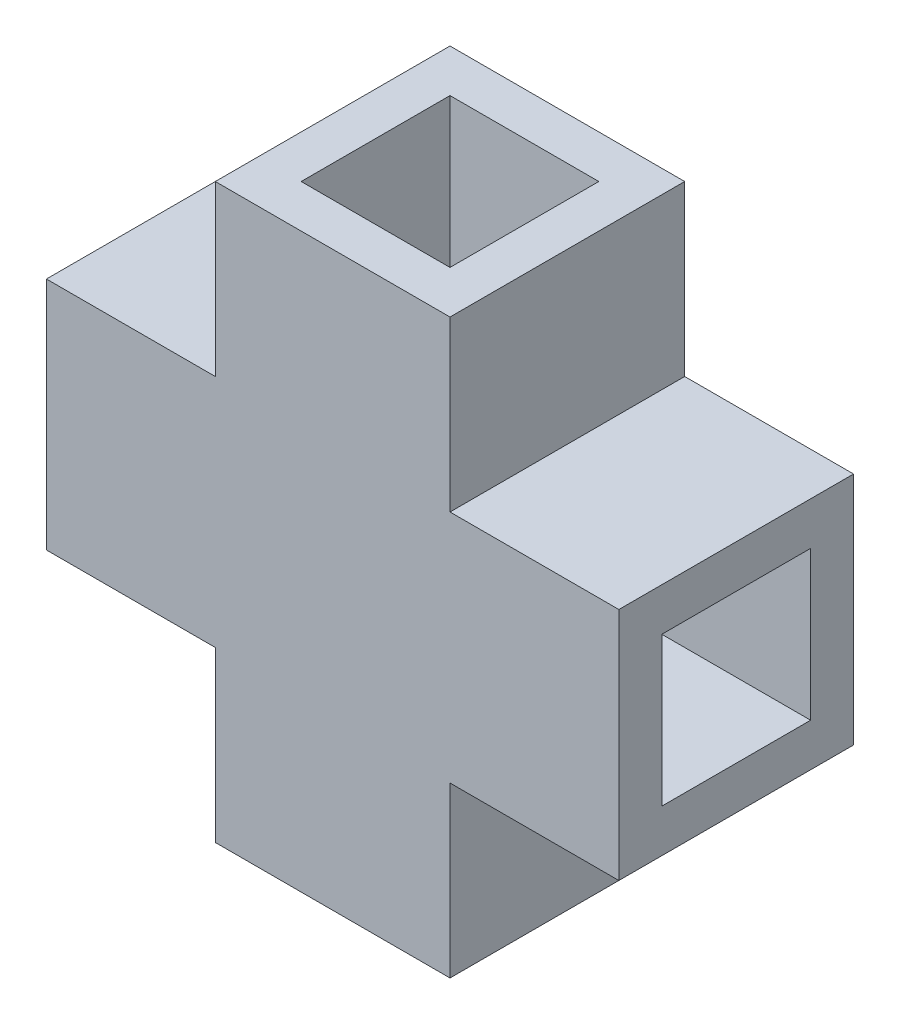
ISO-10303-21;
HEADER;
FILE_DESCRIPTION(('STEP AP214'),'2;1');
FILE_NAME('part.step','',(''),(''),'','','');
FILE_SCHEMA(('AUTOMOTIVE_DESIGN { 1 0 10303 214 1 1 1 1 }'));
ENDSEC;
DATA;
#1=APPLICATION_CONTEXT('core data for automotive mechanical design processes');
#2=APPLICATION_PROTOCOL_DEFINITION('international standard','automotive_design',2000,#1);
#3=PRODUCT_CONTEXT('',#1,'mechanical');
#4=PRODUCT('Part','Part','',(#3));
#5=PRODUCT_RELATED_PRODUCT_CATEGORY('part','',(#4));
#6=PRODUCT_DEFINITION_FORMATION('','',#4);
#7=PRODUCT_DEFINITION_CONTEXT('part definition',#1,'design');
#8=PRODUCT_DEFINITION('design','',#6,#7);
#9=PRODUCT_DEFINITION_SHAPE('','',#8);
#10=(LENGTH_UNIT() NAMED_UNIT(*) SI_UNIT(.MILLI.,.METRE.));
#11=(NAMED_UNIT(*) PLANE_ANGLE_UNIT() SI_UNIT($,.RADIAN.));
#12=(NAMED_UNIT(*) SI_UNIT($,.STERADIAN.) SOLID_ANGLE_UNIT());
#13=UNCERTAINTY_MEASURE_WITH_UNIT(LENGTH_MEASURE(1.E-05),#10,'distance_accuracy_value','');
#14=(GEOMETRIC_REPRESENTATION_CONTEXT(3) GLOBAL_UNCERTAINTY_ASSIGNED_CONTEXT((#13)) GLOBAL_UNIT_ASSIGNED_CONTEXT((#10,
#11,#12)) REPRESENTATION_CONTEXT('',''));
#15=CARTESIAN_POINT('',(0.,0.,0.));
#16=DIRECTION('',(0.,0.,1.));
#17=DIRECTION('',(1.,0.,0.));
#18=AXIS2_PLACEMENT_3D('',#15,#16,#17);
#19=CARTESIAN_POINT('',(-10.,0.,8.2));
#20=DIRECTION('',(1.,0.,0.));
#21=DIRECTION('',(0.,1.,0.));
#22=AXIS2_PLACEMENT_3D('',#19,#20,#21);
#23=PLANE('',#22);
#24=DIRECTION('',(0.,-1.,0.));
#25=VECTOR('',#24,1.);
#26=CARTESIAN_POINT('',(-10.,0.,0.));
#27=LINE('',#26,#25);
#28=CARTESIAN_POINT('',(-10.,4.1,0.));
#29=VERTEX_POINT('',#28);
#30=CARTESIAN_POINT('',(-10.,-4.1,0.));
#31=VERTEX_POINT('',#30);
#32=EDGE_CURVE('E311',#29,#31,#27,.T.);
#33=ORIENTED_EDGE('',*,*,#32,.T.);
#34=DIRECTION('',(0.,0.,-1.));
#35=VECTOR('',#34,1.);
#36=CARTESIAN_POINT('',(-10.,-4.1,8.2));
#37=LINE('',#36,#35);
#38=CARTESIAN_POINT('',(-10.,-4.1,8.2));
#39=VERTEX_POINT('',#38);
#40=EDGE_CURVE('E11',#39,#31,#37,.T.);
#41=ORIENTED_EDGE('',*,*,#40,.F.);
#42=DIRECTION('',(0.,-1.,0.));
#43=VECTOR('',#42,1.);
#44=CARTESIAN_POINT('',(-10.,0.,8.2));
#45=LINE('',#44,#43);
#46=CARTESIAN_POINT('',(-10.,4.1,8.2));
#47=VERTEX_POINT('',#46);
#48=EDGE_CURVE('E346',#47,#39,#45,.T.);
#49=ORIENTED_EDGE('',*,*,#48,.F.);
#50=DIRECTION('',(0.,0.,-1.));
#51=VECTOR('',#50,1.);
#52=CARTESIAN_POINT('',(-10.,4.1,8.2));
#53=LINE('',#52,#51);
#54=EDGE_CURVE('E390',#47,#29,#53,.T.);
#55=ORIENTED_EDGE('',*,*,#54,.T.);
#56=EDGE_LOOP('',(#33,#41,#49,#55));
#57=FACE_BOUND('',#56,.T.);
#58=DIRECTION('',(0.,-1.,0.));
#59=VECTOR('',#58,1.);
#60=CARTESIAN_POINT('',(-10.,0.,1.5));
#61=LINE('',#60,#59);
#62=CARTESIAN_POINT('',(-10.,2.6,1.5));
#63=VERTEX_POINT('',#62);
#64=CARTESIAN_POINT('',(-10.,-2.6,1.5));
#65=VERTEX_POINT('',#64);
#66=EDGE_CURVE('E217',#63,#65,#61,.T.);
#67=ORIENTED_EDGE('',*,*,#66,.F.);
#68=DIRECTION('',(0.,0.,-1.));
#69=VECTOR('',#68,1.);
#70=CARTESIAN_POINT('',(-10.,2.6,8.2));
#71=LINE('',#70,#69);
#72=CARTESIAN_POINT('',(-10.,2.6,6.7));
#73=VERTEX_POINT('',#72);
#74=EDGE_CURVE('E268',#73,#63,#71,.T.);
#75=ORIENTED_EDGE('',*,*,#74,.F.);
#76=DIRECTION('',(0.,-1.,0.));
#77=VECTOR('',#76,1.);
#78=CARTESIAN_POINT('',(-10.,0.,6.7));
#79=LINE('',#78,#77);
#80=CARTESIAN_POINT('',(-10.,-2.6,6.7));
#81=VERTEX_POINT('',#80);
#82=EDGE_CURVE('E286',#73,#81,#79,.T.);
#83=ORIENTED_EDGE('',*,*,#82,.T.);
#84=DIRECTION('',(0.,0.,-1.));
#85=VECTOR('',#84,1.);
#86=CARTESIAN_POINT('',(-10.,-2.6,8.2));
#87=LINE('',#86,#85);
#88=EDGE_CURVE('E229',#81,#65,#87,.T.);
#89=ORIENTED_EDGE('',*,*,#88,.T.);
#90=EDGE_LOOP('',(#67,#75,#83,#89));
#91=FACE_BOUND('',#90,.T.);
#92=ADVANCED_FACE('F46',(#57,#91),#23,.F.);
#93=CARTESIAN_POINT('',(0.,-10.,8.2));
#94=DIRECTION('',(0.,1.,0.));
#95=DIRECTION('',(0.,0.,1.));
#96=AXIS2_PLACEMENT_3D('',#93,#94,#95);
#97=PLANE('',#96);
#98=DIRECTION('',(1.,0.,0.));
#99=VECTOR('',#98,1.);
#100=CARTESIAN_POINT('',(0.,-10.,0.));
#101=LINE('',#100,#99);
#102=CARTESIAN_POINT('',(-4.1,-10.,0.));
#103=VERTEX_POINT('',#102);
#104=CARTESIAN_POINT('',(4.1,-10.,0.));
#105=VERTEX_POINT('',#104);
#106=EDGE_CURVE('E400',#103,#105,#101,.T.);
#107=ORIENTED_EDGE('',*,*,#106,.T.);
#108=DIRECTION('',(0.,0.,-1.));
#109=VECTOR('',#108,1.);
#110=CARTESIAN_POINT('',(4.1,-10.,8.2));
#111=LINE('',#110,#109);
#112=CARTESIAN_POINT('',(4.1,-10.,8.2));
#113=VERTEX_POINT('',#112);
#114=EDGE_CURVE('E458',#113,#105,#111,.T.);
#115=ORIENTED_EDGE('',*,*,#114,.F.);
#116=DIRECTION('',(1.,0.,0.));
#117=VECTOR('',#116,1.);
#118=CARTESIAN_POINT('',(0.,-10.,8.2));
#119=LINE('',#118,#117);
#120=CARTESIAN_POINT('',(-4.1,-10.,8.2));
#121=VERTEX_POINT('',#120);
#122=EDGE_CURVE('E357',#121,#113,#119,.T.);
#123=ORIENTED_EDGE('',*,*,#122,.F.);
#124=DIRECTION('',(0.,0.,-1.));
#125=VECTOR('',#124,1.);
#126=CARTESIAN_POINT('',(-4.1,-10.,8.2));
#127=LINE('',#126,#125);
#128=EDGE_CURVE('E461',#121,#103,#127,.T.);
#129=ORIENTED_EDGE('',*,*,#128,.T.);
#130=EDGE_LOOP('',(#107,#115,#123,#129));
#131=FACE_BOUND('',#130,.T.);
#132=DIRECTION('',(1.,0.,0.));
#133=VECTOR('',#132,1.);
#134=CARTESIAN_POINT('',(0.,-10.,1.5));
#135=LINE('',#134,#133);
#136=CARTESIAN_POINT('',(-2.6,-10.,1.5));
#137=VERTEX_POINT('',#136);
#138=CARTESIAN_POINT('',(2.6,-10.,1.5));
#139=VERTEX_POINT('',#138);
#140=EDGE_CURVE('E236',#137,#139,#135,.T.);
#141=ORIENTED_EDGE('',*,*,#140,.F.);
#142=DIRECTION('',(0.,0.,-1.));
#143=VECTOR('',#142,1.);
#144=CARTESIAN_POINT('',(-2.6,-10.,8.2));
#145=LINE('',#144,#143);
#146=CARTESIAN_POINT('',(-2.6,-10.,6.7));
#147=VERTEX_POINT('',#146);
#148=EDGE_CURVE('E230',#147,#137,#145,.T.);
#149=ORIENTED_EDGE('',*,*,#148,.F.);
#150=DIRECTION('',(1.,0.,0.));
#151=VECTOR('',#150,1.);
#152=CARTESIAN_POINT('',(0.,-10.,6.7));
#153=LINE('',#152,#151);
#154=CARTESIAN_POINT('',(2.6,-10.,6.7));
#155=VERTEX_POINT('',#154);
#156=EDGE_CURVE('E69',#147,#155,#153,.T.);
#157=ORIENTED_EDGE('',*,*,#156,.T.);
#158=DIRECTION('',(0.,0.,-1.));
#159=VECTOR('',#158,1.);
#160=CARTESIAN_POINT('',(2.6,-10.,8.2));
#161=LINE('',#160,#159);
#162=EDGE_CURVE('E276',#155,#139,#161,.T.);
#163=ORIENTED_EDGE('',*,*,#162,.T.);
#164=EDGE_LOOP('',(#141,#149,#157,#163));
#165=FACE_BOUND('',#164,.T.);
#166=ADVANCED_FACE('F481',(#131,#165),#97,.F.);
#167=CARTESIAN_POINT('',(10.,0.,8.2));
#168=DIRECTION('',(1.,0.,0.));
#169=DIRECTION('',(0.,1.,0.));
#170=AXIS2_PLACEMENT_3D('',#167,#168,#169);
#171=PLANE('',#170);
#172=DIRECTION('',(0.,-1.,0.));
#173=VECTOR('',#172,1.);
#174=CARTESIAN_POINT('',(10.,0.,0.));
#175=LINE('',#174,#173);
#176=CARTESIAN_POINT('',(10.,4.1,0.));
#177=VERTEX_POINT('',#176);
#178=CARTESIAN_POINT('',(10.,-4.1,0.));
#179=VERTEX_POINT('',#178);
#180=EDGE_CURVE('E412',#177,#179,#175,.T.);
#181=ORIENTED_EDGE('',*,*,#180,.F.);
#182=DIRECTION('',(0.,0.,-1.));
#183=VECTOR('',#182,1.);
#184=CARTESIAN_POINT('',(10.,4.1,8.2));
#185=LINE('',#184,#183);
#186=CARTESIAN_POINT('',(10.,4.1,8.2));
#187=VERTEX_POINT('',#186);
#188=EDGE_CURVE('E449',#187,#177,#185,.T.);
#189=ORIENTED_EDGE('',*,*,#188,.F.);
#190=DIRECTION('',(0.,-1.,0.));
#191=VECTOR('',#190,1.);
#192=CARTESIAN_POINT('',(10.,0.,8.2));
#193=LINE('',#192,#191);
#194=CARTESIAN_POINT('',(10.,-4.1,8.2));
#195=VERTEX_POINT('',#194);
#196=EDGE_CURVE('E367',#187,#195,#193,.T.);
#197=ORIENTED_EDGE('',*,*,#196,.T.);
#198=DIRECTION('',(0.,0.,-1.));
#199=VECTOR('',#198,1.);
#200=CARTESIAN_POINT('',(10.,-4.1,8.2));
#201=LINE('',#200,#199);
#202=EDGE_CURVE('E452',#195,#179,#201,.T.);
#203=ORIENTED_EDGE('',*,*,#202,.T.);
#204=EDGE_LOOP('',(#181,#189,#197,#203));
#205=FACE_BOUND('',#204,.T.);
#206=DIRECTION('',(0.,0.,-1.));
#207=VECTOR('',#206,1.);
#208=CARTESIAN_POINT('',(10.,2.6,8.2));
#209=LINE('',#208,#207);
#210=CARTESIAN_POINT('',(10.,2.6,6.7));
#211=VERTEX_POINT('',#210);
#212=CARTESIAN_POINT('',(10.,2.6,1.5));
#213=VERTEX_POINT('',#212);
#214=EDGE_CURVE('E303',#211,#213,#209,.T.);
#215=ORIENTED_EDGE('',*,*,#214,.T.);
#216=DIRECTION('',(0.,-1.,0.));
#217=VECTOR('',#216,1.);
#218=CARTESIAN_POINT('',(10.,0.,1.5));
#219=LINE('',#218,#217);
#220=CARTESIAN_POINT('',(10.,-2.6,1.5));
#221=VERTEX_POINT('',#220);
#222=EDGE_CURVE('E281',#213,#221,#219,.T.);
#223=ORIENTED_EDGE('',*,*,#222,.T.);
#224=DIRECTION('',(0.,0.,-1.));
#225=VECTOR('',#224,1.);
#226=CARTESIAN_POINT('',(10.,-2.6,8.2));
#227=LINE('',#226,#225);
#228=CARTESIAN_POINT('',(10.,-2.6,6.7));
#229=VERTEX_POINT('',#228);
#230=EDGE_CURVE('E277',#229,#221,#227,.T.);
#231=ORIENTED_EDGE('',*,*,#230,.F.);
#232=DIRECTION('',(0.,-1.,0.));
#233=VECTOR('',#232,1.);
#234=CARTESIAN_POINT('',(10.,0.,6.7));
#235=LINE('',#234,#233);
#236=EDGE_CURVE('E253',#211,#229,#235,.T.);
#237=ORIENTED_EDGE('',*,*,#236,.F.);
#238=EDGE_LOOP('',(#215,#223,#231,#237));
#239=FACE_BOUND('',#238,.T.);
#240=ADVANCED_FACE('F517',(#205,#239),#171,.T.);
#241=CARTESIAN_POINT('',(0.,10.,8.2));
#242=DIRECTION('',(0.,1.,0.));
#243=DIRECTION('',(0.,0.,1.));
#244=AXIS2_PLACEMENT_3D('',#241,#242,#243);
#245=PLANE('',#244);
#246=DIRECTION('',(1.,0.,0.));
#247=VECTOR('',#246,1.);
#248=CARTESIAN_POINT('',(0.,10.,0.));
#249=LINE('',#248,#247);
#250=CARTESIAN_POINT('',(-4.1,10.,0.));
#251=VERTEX_POINT('',#250);
#252=CARTESIAN_POINT('',(4.1,10.,0.));
#253=VERTEX_POINT('',#252);
#254=EDGE_CURVE('E424',#251,#253,#249,.T.);
#255=ORIENTED_EDGE('',*,*,#254,.F.);
#256=DIRECTION('',(0.,0.,-1.));
#257=VECTOR('',#256,1.);
#258=CARTESIAN_POINT('',(-4.1,10.,8.2));
#259=LINE('',#258,#257);
#260=CARTESIAN_POINT('',(-4.1,10.,8.2));
#261=VERTEX_POINT('',#260);
#262=EDGE_CURVE('E440',#261,#251,#259,.T.);
#263=ORIENTED_EDGE('',*,*,#262,.F.);
#264=DIRECTION('',(1.,0.,0.));
#265=VECTOR('',#264,1.);
#266=CARTESIAN_POINT('',(0.,10.,8.2));
#267=LINE('',#266,#265);
#268=CARTESIAN_POINT('',(4.1,10.,8.2));
#269=VERTEX_POINT('',#268);
#270=EDGE_CURVE('E379',#261,#269,#267,.T.);
#271=ORIENTED_EDGE('',*,*,#270,.T.);
#272=DIRECTION('',(0.,0.,-1.));
#273=VECTOR('',#272,1.);
#274=CARTESIAN_POINT('',(4.1,10.,8.2));
#275=LINE('',#274,#273);
#276=EDGE_CURVE('E443',#269,#253,#275,.T.);
#277=ORIENTED_EDGE('',*,*,#276,.T.);
#278=EDGE_LOOP('',(#255,#263,#271,#277));
#279=FACE_BOUND('',#278,.T.);
#280=DIRECTION('',(0.,0.,-1.));
#281=VECTOR('',#280,1.);
#282=CARTESIAN_POINT('',(-2.6,10.,8.2));
#283=LINE('',#282,#281);
#284=CARTESIAN_POINT('',(-2.6,10.,6.7));
#285=VERTEX_POINT('',#284);
#286=CARTESIAN_POINT('',(-2.6,10.,1.5));
#287=VERTEX_POINT('',#286);
#288=EDGE_CURVE('E308',#285,#287,#283,.T.);
#289=ORIENTED_EDGE('',*,*,#288,.T.);
#290=DIRECTION('',(1.,0.,0.));
#291=VECTOR('',#290,1.);
#292=CARTESIAN_POINT('',(0.,10.,1.5));
#293=LINE('',#292,#291);
#294=CARTESIAN_POINT('',(2.6,10.,1.5));
#295=VERTEX_POINT('',#294);
#296=EDGE_CURVE('E291',#287,#295,#293,.T.);
#297=ORIENTED_EDGE('',*,*,#296,.T.);
#298=DIRECTION('',(0.,0.,-1.));
#299=VECTOR('',#298,1.);
#300=CARTESIAN_POINT('',(2.6,10.,8.2));
#301=LINE('',#300,#299);
#302=CARTESIAN_POINT('',(2.6,10.,6.7));
#303=VERTEX_POINT('',#302);
#304=EDGE_CURVE('E304',#303,#295,#301,.T.);
#305=ORIENTED_EDGE('',*,*,#304,.F.);
#306=DIRECTION('',(1.,0.,0.));
#307=VECTOR('',#306,1.);
#308=CARTESIAN_POINT('',(0.,10.,6.7));
#309=LINE('',#308,#307);
#310=EDGE_CURVE('E262',#285,#303,#309,.T.);
#311=ORIENTED_EDGE('',*,*,#310,.F.);
#312=EDGE_LOOP('',(#289,#297,#305,#311));
#313=FACE_BOUND('',#312,.T.);
#314=ADVANCED_FACE('F503',(#279,#313),#245,.T.);
#315=CARTESIAN_POINT('',(0.,-4.1,8.2));
#316=DIRECTION('',(0.,1.,0.));
#317=DIRECTION('',(0.,0.,1.));
#318=AXIS2_PLACEMENT_3D('',#315,#316,#317);
#319=PLANE('',#318);
#320=DIRECTION('',(1.,0.,0.));
#321=VECTOR('',#320,1.);
#322=CARTESIAN_POINT('',(0.,-4.1,0.));
#323=LINE('',#322,#321);
#324=CARTESIAN_POINT('',(-4.1,-4.1,0.));
#325=VERTEX_POINT('',#324);
#326=EDGE_CURVE('E394',#31,#325,#323,.T.);
#327=ORIENTED_EDGE('',*,*,#326,.T.);
#328=DIRECTION('',(0.,0.,-1.));
#329=VECTOR('',#328,1.);
#330=CARTESIAN_POINT('',(-4.1,-4.1,8.2));
#331=LINE('',#330,#329);
#332=CARTESIAN_POINT('',(-4.1,-4.1,8.2));
#333=VERTEX_POINT('',#332);
#334=EDGE_CURVE('E54',#333,#325,#331,.T.);
#335=ORIENTED_EDGE('',*,*,#334,.F.);
#336=DIRECTION('',(1.,0.,0.));
#337=VECTOR('',#336,1.);
#338=CARTESIAN_POINT('',(0.,-4.1,8.2));
#339=LINE('',#338,#337);
#340=EDGE_CURVE('E350',#39,#333,#339,.T.);
#341=ORIENTED_EDGE('',*,*,#340,.F.);
#342=ORIENTED_EDGE('',*,*,#40,.T.);
#343=EDGE_LOOP('',(#327,#335,#341,#342));
#344=FACE_BOUND('',#343,.T.);
#345=ADVANCED_FACE('F490',(#344),#319,.F.);
#346=CARTESIAN_POINT('',(-4.1,0.,8.2));
#347=DIRECTION('',(1.,0.,0.));
#348=DIRECTION('',(0.,1.,0.));
#349=AXIS2_PLACEMENT_3D('',#346,#347,#348);
#350=PLANE('',#349);
#351=DIRECTION('',(0.,-1.,0.));
#352=VECTOR('',#351,1.);
#353=CARTESIAN_POINT('',(-4.1,0.,0.));
#354=LINE('',#353,#352);
#355=EDGE_CURVE('E397',#325,#103,#354,.T.);
#356=ORIENTED_EDGE('',*,*,#355,.T.);
#357=ORIENTED_EDGE('',*,*,#128,.F.);
#358=DIRECTION('',(0.,-1.,0.));
#359=VECTOR('',#358,1.);
#360=CARTESIAN_POINT('',(-4.1,0.,8.2));
#361=LINE('',#360,#359);
#362=EDGE_CURVE('E354',#333,#121,#361,.T.);
#363=ORIENTED_EDGE('',*,*,#362,.F.);
#364=ORIENTED_EDGE('',*,*,#334,.T.);
#365=EDGE_LOOP('',(#356,#357,#363,#364));
#366=FACE_BOUND('',#365,.T.);
#367=ADVANCED_FACE('F470',(#366),#350,.F.);
#368=CARTESIAN_POINT('',(4.1,0.,8.2));
#369=DIRECTION('',(1.,0.,0.));
#370=DIRECTION('',(0.,1.,0.));
#371=AXIS2_PLACEMENT_3D('',#368,#369,#370);
#372=PLANE('',#371);
#373=DIRECTION('',(0.,-1.,0.));
#374=VECTOR('',#373,1.);
#375=CARTESIAN_POINT('',(4.1,0.,0.));
#376=LINE('',#375,#374);
#377=CARTESIAN_POINT('',(4.1,-4.1,0.));
#378=VERTEX_POINT('',#377);
#379=EDGE_CURVE('E404',#378,#105,#376,.T.);
#380=ORIENTED_EDGE('',*,*,#379,.F.);
#381=DIRECTION('',(0.,0.,-1.));
#382=VECTOR('',#381,1.);
#383=CARTESIAN_POINT('',(4.1,-4.1,8.2));
#384=LINE('',#383,#382);
#385=CARTESIAN_POINT('',(4.1,-4.1,8.2));
#386=VERTEX_POINT('',#385);
#387=EDGE_CURVE('E455',#386,#378,#384,.T.);
#388=ORIENTED_EDGE('',*,*,#387,.F.);
#389=DIRECTION('',(0.,-1.,0.));
#390=VECTOR('',#389,1.);
#391=CARTESIAN_POINT('',(4.1,0.,8.2));
#392=LINE('',#391,#390);
#393=EDGE_CURVE('E360',#386,#113,#392,.T.);
#394=ORIENTED_EDGE('',*,*,#393,.T.);
#395=ORIENTED_EDGE('',*,*,#114,.T.);
#396=EDGE_LOOP('',(#380,#388,#394,#395));
#397=FACE_BOUND('',#396,.T.);
#398=ADVANCED_FACE('F524',(#397),#372,.T.);
#399=CARTESIAN_POINT('',(0.,-4.1,8.2));
#400=DIRECTION('',(0.,1.,0.));
#401=DIRECTION('',(0.,0.,1.));
#402=AXIS2_PLACEMENT_3D('',#399,#400,#401);
#403=PLANE('',#402);
#404=DIRECTION('',(1.,0.,0.));
#405=VECTOR('',#404,1.);
#406=CARTESIAN_POINT('',(0.,-4.1,0.));
#407=LINE('',#406,#405);
#408=EDGE_CURVE('E408',#378,#179,#407,.T.);
#409=ORIENTED_EDGE('',*,*,#408,.T.);
#410=ORIENTED_EDGE('',*,*,#202,.F.);
#411=DIRECTION('',(1.,0.,0.));
#412=VECTOR('',#411,1.);
#413=CARTESIAN_POINT('',(0.,-4.1,8.2));
#414=LINE('',#413,#412);
#415=EDGE_CURVE('E364',#386,#195,#414,.T.);
#416=ORIENTED_EDGE('',*,*,#415,.F.);
#417=ORIENTED_EDGE('',*,*,#387,.T.);
#418=EDGE_LOOP('',(#409,#410,#416,#417));
#419=FACE_BOUND('',#418,.T.);
#420=ADVANCED_FACE('F522',(#419),#403,.F.);
#421=CARTESIAN_POINT('',(0.,4.1,8.2));
#422=DIRECTION('',(0.,1.,0.));
#423=DIRECTION('',(0.,0.,1.));
#424=AXIS2_PLACEMENT_3D('',#421,#422,#423);
#425=PLANE('',#424);
#426=DIRECTION('',(1.,0.,0.));
#427=VECTOR('',#426,1.);
#428=CARTESIAN_POINT('',(0.,4.1,0.));
#429=LINE('',#428,#427);
#430=CARTESIAN_POINT('',(4.1,4.1,0.));
#431=VERTEX_POINT('',#430);
#432=EDGE_CURVE('E416',#431,#177,#429,.T.);
#433=ORIENTED_EDGE('',*,*,#432,.F.);
#434=DIRECTION('',(0.,0.,-1.));
#435=VECTOR('',#434,1.);
#436=CARTESIAN_POINT('',(4.1,4.1,8.2));
#437=LINE('',#436,#435);
#438=CARTESIAN_POINT('',(4.1,4.1,8.2));
#439=VERTEX_POINT('',#438);
#440=EDGE_CURVE('E446',#439,#431,#437,.T.);
#441=ORIENTED_EDGE('',*,*,#440,.F.);
#442=DIRECTION('',(1.,0.,0.));
#443=VECTOR('',#442,1.);
#444=CARTESIAN_POINT('',(0.,4.1,8.2));
#445=LINE('',#444,#443);
#446=EDGE_CURVE('E371',#439,#187,#445,.T.);
#447=ORIENTED_EDGE('',*,*,#446,.T.);
#448=ORIENTED_EDGE('',*,*,#188,.T.);
#449=EDGE_LOOP('',(#433,#441,#447,#448));
#450=FACE_BOUND('',#449,.T.);
#451=ADVANCED_FACE('F513',(#450),#425,.T.);
#452=CARTESIAN_POINT('',(4.1,0.,8.2));
#453=DIRECTION('',(1.,0.,0.));
#454=DIRECTION('',(0.,1.,0.));
#455=AXIS2_PLACEMENT_3D('',#452,#453,#454);
#456=PLANE('',#455);
#457=DIRECTION('',(0.,-1.,0.));
#458=VECTOR('',#457,1.);
#459=CARTESIAN_POINT('',(4.1,0.,0.));
#460=LINE('',#459,#458);
#461=EDGE_CURVE('E420',#253,#431,#460,.T.);
#462=ORIENTED_EDGE('',*,*,#461,.F.);
#463=ORIENTED_EDGE('',*,*,#276,.F.);
#464=DIRECTION('',(0.,-1.,0.));
#465=VECTOR('',#464,1.);
#466=CARTESIAN_POINT('',(4.1,0.,8.2));
#467=LINE('',#466,#465);
#468=EDGE_CURVE('E375',#269,#439,#467,.T.);
#469=ORIENTED_EDGE('',*,*,#468,.T.);
#470=ORIENTED_EDGE('',*,*,#440,.T.);
#471=EDGE_LOOP('',(#462,#463,#469,#470));
#472=FACE_BOUND('',#471,.T.);
#473=ADVANCED_FACE('F509',(#472),#456,.T.);
#474=CARTESIAN_POINT('',(-4.1,0.,8.2));
#475=DIRECTION('',(1.,0.,0.));
#476=DIRECTION('',(0.,1.,0.));
#477=AXIS2_PLACEMENT_3D('',#474,#475,#476);
#478=PLANE('',#477);
#479=DIRECTION('',(0.,-1.,0.));
#480=VECTOR('',#479,1.);
#481=CARTESIAN_POINT('',(-4.1,0.,0.));
#482=LINE('',#481,#480);
#483=CARTESIAN_POINT('',(-4.1,4.1,0.));
#484=VERTEX_POINT('',#483);
#485=EDGE_CURVE('E428',#251,#484,#482,.T.);
#486=ORIENTED_EDGE('',*,*,#485,.T.);
#487=DIRECTION('',(0.,0.,-1.));
#488=VECTOR('',#487,1.);
#489=CARTESIAN_POINT('',(-4.1,4.1,8.2));
#490=LINE('',#489,#488);
#491=CARTESIAN_POINT('',(-4.1,4.1,8.2));
#492=VERTEX_POINT('',#491);
#493=EDGE_CURVE('E437',#492,#484,#490,.T.);
#494=ORIENTED_EDGE('',*,*,#493,.F.);
#495=DIRECTION('',(0.,-1.,0.));
#496=VECTOR('',#495,1.);
#497=CARTESIAN_POINT('',(-4.1,0.,8.2));
#498=LINE('',#497,#496);
#499=EDGE_CURVE('E383',#261,#492,#498,.T.);
#500=ORIENTED_EDGE('',*,*,#499,.F.);
#501=ORIENTED_EDGE('',*,*,#262,.T.);
#502=EDGE_LOOP('',(#486,#494,#500,#501));
#503=FACE_BOUND('',#502,.T.);
#504=ADVANCED_FACE('F500',(#503),#478,.F.);
#505=CARTESIAN_POINT('',(0.,4.1,8.2));
#506=DIRECTION('',(0.,1.,0.));
#507=DIRECTION('',(0.,0.,1.));
#508=AXIS2_PLACEMENT_3D('',#505,#506,#507);
#509=PLANE('',#508);
#510=DIRECTION('',(1.,0.,0.));
#511=VECTOR('',#510,1.);
#512=CARTESIAN_POINT('',(0.,4.1,0.));
#513=LINE('',#512,#511);
#514=EDGE_CURVE('E351',#29,#484,#513,.T.);
#515=ORIENTED_EDGE('',*,*,#514,.F.);
#516=ORIENTED_EDGE('',*,*,#54,.F.);
#517=DIRECTION('',(1.,0.,0.));
#518=VECTOR('',#517,1.);
#519=CARTESIAN_POINT('',(0.,4.1,8.2));
#520=LINE('',#519,#518);
#521=EDGE_CURVE('E386',#47,#492,#520,.T.);
#522=ORIENTED_EDGE('',*,*,#521,.T.);
#523=ORIENTED_EDGE('',*,*,#493,.T.);
#524=EDGE_LOOP('',(#515,#516,#522,#523));
#525=FACE_BOUND('',#524,.T.);
#526=ADVANCED_FACE('F496',(#525),#509,.T.);
#527=CARTESIAN_POINT('',(0.,0.,8.2));
#528=DIRECTION('',(0.,0.,1.));
#529=DIRECTION('',(1.,0.,0.));
#530=AXIS2_PLACEMENT_3D('',#527,#528,#529);
#531=PLANE('',#530);
#532=ORIENTED_EDGE('',*,*,#48,.T.);
#533=ORIENTED_EDGE('',*,*,#340,.T.);
#534=ORIENTED_EDGE('',*,*,#362,.T.);
#535=ORIENTED_EDGE('',*,*,#122,.T.);
#536=ORIENTED_EDGE('',*,*,#393,.F.);
#537=ORIENTED_EDGE('',*,*,#415,.T.);
#538=ORIENTED_EDGE('',*,*,#196,.F.);
#539=ORIENTED_EDGE('',*,*,#446,.F.);
#540=ORIENTED_EDGE('',*,*,#468,.F.);
#541=ORIENTED_EDGE('',*,*,#270,.F.);
#542=ORIENTED_EDGE('',*,*,#499,.T.);
#543=ORIENTED_EDGE('',*,*,#521,.F.);
#544=EDGE_LOOP('',(#532,#533,#534,#535,#536,#537,#538,#539,#540,#541,#542,#543));
#545=FACE_BOUND('',#544,.T.);
#546=ADVANCED_FACE('F486',(#545),#531,.T.);
#547=CARTESIAN_POINT('',(0.,0.,0.));
#548=DIRECTION('',(0.,0.,1.));
#549=DIRECTION('',(1.,0.,0.));
#550=AXIS2_PLACEMENT_3D('',#547,#548,#549);
#551=PLANE('',#550);
#552=ORIENTED_EDGE('',*,*,#32,.F.);
#553=ORIENTED_EDGE('',*,*,#514,.T.);
#554=ORIENTED_EDGE('',*,*,#485,.F.);
#555=ORIENTED_EDGE('',*,*,#254,.T.);
#556=ORIENTED_EDGE('',*,*,#461,.T.);
#557=ORIENTED_EDGE('',*,*,#432,.T.);
#558=ORIENTED_EDGE('',*,*,#180,.T.);
#559=ORIENTED_EDGE('',*,*,#408,.F.);
#560=ORIENTED_EDGE('',*,*,#379,.T.);
#561=ORIENTED_EDGE('',*,*,#106,.F.);
#562=ORIENTED_EDGE('',*,*,#355,.F.);
#563=ORIENTED_EDGE('',*,*,#326,.F.);
#564=EDGE_LOOP('',(#552,#553,#554,#555,#556,#557,#558,#559,#560,#561,#562,#563));
#565=FACE_BOUND('',#564,.T.);
#566=ADVANCED_FACE('F476',(#565),#551,.F.);
#567=CARTESIAN_POINT('',(0.,-2.6,8.2));
#568=DIRECTION('',(0.,1.,0.));
#569=DIRECTION('',(0.,0.,1.));
#570=AXIS2_PLACEMENT_3D('',#567,#568,#569);
#571=PLANE('',#570);
#572=DIRECTION('',(1.,0.,0.));
#573=VECTOR('',#572,1.);
#574=CARTESIAN_POINT('',(0.,-2.6,1.5));
#575=LINE('',#574,#573);
#576=CARTESIAN_POINT('',(-2.6,-2.6,1.5));
#577=VERTEX_POINT('',#576);
#578=EDGE_CURVE('E209',#65,#577,#575,.T.);
#579=ORIENTED_EDGE('',*,*,#578,.F.);
#580=ORIENTED_EDGE('',*,*,#88,.F.);
#581=DIRECTION('',(1.,0.,0.));
#582=VECTOR('',#581,1.);
#583=CARTESIAN_POINT('',(0.,-2.6,6.7));
#584=LINE('',#583,#582);
#585=CARTESIAN_POINT('',(-2.6,-2.6,6.7));
#586=VERTEX_POINT('',#585);
#587=EDGE_CURVE('E226',#81,#586,#584,.T.);
#588=ORIENTED_EDGE('',*,*,#587,.T.);
#589=DIRECTION('',(0.,0.,-1.));
#590=VECTOR('',#589,1.);
#591=CARTESIAN_POINT('',(-2.6,-2.6,8.2));
#592=LINE('',#591,#590);
#593=EDGE_CURVE('E224',#586,#577,#592,.T.);
#594=ORIENTED_EDGE('',*,*,#593,.T.);
#595=EDGE_LOOP('',(#579,#580,#588,#594));
#596=FACE_BOUND('',#595,.T.);
#597=ADVANCED_FACE('F225',(#596),#571,.T.);
#598=CARTESIAN_POINT('',(-2.6,0.,8.2));
#599=DIRECTION('',(1.,0.,0.));
#600=DIRECTION('',(0.,1.,0.));
#601=AXIS2_PLACEMENT_3D('',#598,#599,#600);
#602=PLANE('',#601);
#603=DIRECTION('',(0.,-1.,0.));
#604=VECTOR('',#603,1.);
#605=CARTESIAN_POINT('',(-2.6,0.,1.5));
#606=LINE('',#605,#604);
#607=EDGE_CURVE('E213',#577,#137,#606,.T.);
#608=ORIENTED_EDGE('',*,*,#607,.F.);
#609=ORIENTED_EDGE('',*,*,#593,.F.);
#610=DIRECTION('',(0.,-1.,0.));
#611=VECTOR('',#610,1.);
#612=CARTESIAN_POINT('',(-2.6,0.,6.7));
#613=LINE('',#612,#611);
#614=EDGE_CURVE('E243',#586,#147,#613,.T.);
#615=ORIENTED_EDGE('',*,*,#614,.T.);
#616=ORIENTED_EDGE('',*,*,#148,.T.);
#617=EDGE_LOOP('',(#608,#609,#615,#616));
#618=FACE_BOUND('',#617,.T.);
#619=ADVANCED_FACE('F232',(#618),#602,.T.);
#620=CARTESIAN_POINT('',(2.6,0.,8.2));
#621=DIRECTION('',(1.,0.,0.));
#622=DIRECTION('',(0.,1.,0.));
#623=AXIS2_PLACEMENT_3D('',#620,#621,#622);
#624=PLANE('',#623);
#625=DIRECTION('',(0.,-1.,0.));
#626=VECTOR('',#625,1.);
#627=CARTESIAN_POINT('',(2.6,0.,1.5));
#628=LINE('',#627,#626);
#629=CARTESIAN_POINT('',(2.6,-2.6,1.5));
#630=VERTEX_POINT('',#629);
#631=EDGE_CURVE('E239',#630,#139,#628,.T.);
#632=ORIENTED_EDGE('',*,*,#631,.T.);
#633=ORIENTED_EDGE('',*,*,#162,.F.);
#634=DIRECTION('',(0.,-1.,0.));
#635=VECTOR('',#634,1.);
#636=CARTESIAN_POINT('',(2.6,0.,6.7));
#637=LINE('',#636,#635);
#638=CARTESIAN_POINT('',(2.6,-2.6,6.7));
#639=VERTEX_POINT('',#638);
#640=EDGE_CURVE('E246',#639,#155,#637,.T.);
#641=ORIENTED_EDGE('',*,*,#640,.F.);
#642=DIRECTION('',(0.,0.,-1.));
#643=VECTOR('',#642,1.);
#644=CARTESIAN_POINT('',(2.6,-2.6,8.2));
#645=LINE('',#644,#643);
#646=EDGE_CURVE('E273',#639,#630,#645,.T.);
#647=ORIENTED_EDGE('',*,*,#646,.T.);
#648=EDGE_LOOP('',(#632,#633,#641,#647));
#649=FACE_BOUND('',#648,.T.);
#650=ADVANCED_FACE('F630',(#649),#624,.F.);
#651=CARTESIAN_POINT('',(0.,-2.6,8.2));
#652=DIRECTION('',(0.,1.,0.));
#653=DIRECTION('',(0.,0.,1.));
#654=AXIS2_PLACEMENT_3D('',#651,#652,#653);
#655=PLANE('',#654);
#656=DIRECTION('',(1.,0.,0.));
#657=VECTOR('',#656,1.);
#658=CARTESIAN_POINT('',(0.,-2.6,1.5));
#659=LINE('',#658,#657);
#660=EDGE_CURVE('E272',#630,#221,#659,.T.);
#661=ORIENTED_EDGE('',*,*,#660,.F.);
#662=ORIENTED_EDGE('',*,*,#646,.F.);
#663=DIRECTION('',(1.,0.,0.));
#664=VECTOR('',#663,1.);
#665=CARTESIAN_POINT('',(0.,-2.6,6.7));
#666=LINE('',#665,#664);
#667=EDGE_CURVE('E249',#639,#229,#666,.T.);
#668=ORIENTED_EDGE('',*,*,#667,.T.);
#669=ORIENTED_EDGE('',*,*,#230,.T.);
#670=EDGE_LOOP('',(#661,#662,#668,#669));
#671=FACE_BOUND('',#670,.T.);
#672=ADVANCED_FACE('F639',(#671),#655,.T.);
#673=CARTESIAN_POINT('',(0.,2.6,8.2));
#674=DIRECTION('',(0.,1.,0.));
#675=DIRECTION('',(0.,0.,1.));
#676=AXIS2_PLACEMENT_3D('',#673,#674,#675);
#677=PLANE('',#676);
#678=DIRECTION('',(1.,0.,0.));
#679=VECTOR('',#678,1.);
#680=CARTESIAN_POINT('',(0.,2.6,1.5));
#681=LINE('',#680,#679);
#682=CARTESIAN_POINT('',(2.6,2.6,1.5));
#683=VERTEX_POINT('',#682);
#684=EDGE_CURVE('E296',#683,#213,#681,.T.);
#685=ORIENTED_EDGE('',*,*,#684,.T.);
#686=ORIENTED_EDGE('',*,*,#214,.F.);
#687=DIRECTION('',(1.,0.,0.));
#688=VECTOR('',#687,1.);
#689=CARTESIAN_POINT('',(0.,2.6,6.7));
#690=LINE('',#689,#688);
#691=CARTESIAN_POINT('',(2.6,2.6,6.7));
#692=VERTEX_POINT('',#691);
#693=EDGE_CURVE('E254',#692,#211,#690,.T.);
#694=ORIENTED_EDGE('',*,*,#693,.F.);
#695=DIRECTION('',(0.,0.,-1.));
#696=VECTOR('',#695,1.);
#697=CARTESIAN_POINT('',(2.6,2.6,8.2));
#698=LINE('',#697,#696);
#699=EDGE_CURVE('E300',#692,#683,#698,.T.);
#700=ORIENTED_EDGE('',*,*,#699,.T.);
#701=EDGE_LOOP('',(#685,#686,#694,#700));
#702=FACE_BOUND('',#701,.T.);
#703=ADVANCED_FACE('F649',(#702),#677,.F.);
#704=CARTESIAN_POINT('',(2.6,0.,8.2));
#705=DIRECTION('',(1.,0.,0.));
#706=DIRECTION('',(0.,1.,0.));
#707=AXIS2_PLACEMENT_3D('',#704,#705,#706);
#708=PLANE('',#707);
#709=DIRECTION('',(0.,-1.,0.));
#710=VECTOR('',#709,1.);
#711=CARTESIAN_POINT('',(2.6,0.,1.5));
#712=LINE('',#711,#710);
#713=EDGE_CURVE('E292',#295,#683,#712,.T.);
#714=ORIENTED_EDGE('',*,*,#713,.T.);
#715=ORIENTED_EDGE('',*,*,#699,.F.);
#716=DIRECTION('',(0.,-1.,0.));
#717=VECTOR('',#716,1.);
#718=CARTESIAN_POINT('',(2.6,0.,6.7));
#719=LINE('',#718,#717);
#720=EDGE_CURVE('E258',#303,#692,#719,.T.);
#721=ORIENTED_EDGE('',*,*,#720,.F.);
#722=ORIENTED_EDGE('',*,*,#304,.T.);
#723=EDGE_LOOP('',(#714,#715,#721,#722));
#724=FACE_BOUND('',#723,.T.);
#725=ADVANCED_FACE('F659',(#724),#708,.F.);
#726=CARTESIAN_POINT('',(-2.6,0.,8.2));
#727=DIRECTION('',(1.,0.,0.));
#728=DIRECTION('',(0.,1.,0.));
#729=AXIS2_PLACEMENT_3D('',#726,#727,#728);
#730=PLANE('',#729);
#731=DIRECTION('',(0.,-1.,0.));
#732=VECTOR('',#731,1.);
#733=CARTESIAN_POINT('',(-2.6,0.,1.5));
#734=LINE('',#733,#732);
#735=CARTESIAN_POINT('',(-2.6,2.6,1.5));
#736=VERTEX_POINT('',#735);
#737=EDGE_CURVE('E287',#287,#736,#734,.T.);
#738=ORIENTED_EDGE('',*,*,#737,.F.);
#739=ORIENTED_EDGE('',*,*,#288,.F.);
#740=DIRECTION('',(0.,-1.,0.));
#741=VECTOR('',#740,1.);
#742=CARTESIAN_POINT('',(-2.6,0.,6.7));
#743=LINE('',#742,#741);
#744=CARTESIAN_POINT('',(-2.6,2.6,6.7));
#745=VERTEX_POINT('',#744);
#746=EDGE_CURVE('E263',#285,#745,#743,.T.);
#747=ORIENTED_EDGE('',*,*,#746,.T.);
#748=DIRECTION('',(0.,0.,-1.));
#749=VECTOR('',#748,1.);
#750=CARTESIAN_POINT('',(-2.6,2.6,8.2));
#751=LINE('',#750,#749);
#752=EDGE_CURVE('E305',#745,#736,#751,.T.);
#753=ORIENTED_EDGE('',*,*,#752,.T.);
#754=EDGE_LOOP('',(#738,#739,#747,#753));
#755=FACE_BOUND('',#754,.T.);
#756=ADVANCED_FACE('F669',(#755),#730,.T.);
#757=CARTESIAN_POINT('',(0.,2.6,8.2));
#758=DIRECTION('',(0.,1.,0.));
#759=DIRECTION('',(0.,0.,1.));
#760=AXIS2_PLACEMENT_3D('',#757,#758,#759);
#761=PLANE('',#760);
#762=DIRECTION('',(1.,0.,0.));
#763=VECTOR('',#762,1.);
#764=CARTESIAN_POINT('',(0.,2.6,1.5));
#765=LINE('',#764,#763);
#766=EDGE_CURVE('E282',#63,#736,#765,.T.);
#767=ORIENTED_EDGE('',*,*,#766,.T.);
#768=ORIENTED_EDGE('',*,*,#752,.F.);
#769=DIRECTION('',(1.,0.,0.));
#770=VECTOR('',#769,1.);
#771=CARTESIAN_POINT('',(0.,2.6,6.7));
#772=LINE('',#771,#770);
#773=EDGE_CURVE('E61',#73,#745,#772,.T.);
#774=ORIENTED_EDGE('',*,*,#773,.F.);
#775=ORIENTED_EDGE('',*,*,#74,.T.);
#776=EDGE_LOOP('',(#767,#768,#774,#775));
#777=FACE_BOUND('',#776,.T.);
#778=ADVANCED_FACE('F679',(#777),#761,.F.);
#779=CARTESIAN_POINT('',(0.,0.,6.7));
#780=DIRECTION('',(0.,0.,1.));
#781=DIRECTION('',(1.,0.,0.));
#782=AXIS2_PLACEMENT_3D('',#779,#780,#781);
#783=PLANE('',#782);
#784=ORIENTED_EDGE('',*,*,#82,.F.);
#785=ORIENTED_EDGE('',*,*,#773,.T.);
#786=ORIENTED_EDGE('',*,*,#746,.F.);
#787=ORIENTED_EDGE('',*,*,#310,.T.);
#788=ORIENTED_EDGE('',*,*,#720,.T.);
#789=ORIENTED_EDGE('',*,*,#693,.T.);
#790=ORIENTED_EDGE('',*,*,#236,.T.);
#791=ORIENTED_EDGE('',*,*,#667,.F.);
#792=ORIENTED_EDGE('',*,*,#640,.T.);
#793=ORIENTED_EDGE('',*,*,#156,.F.);
#794=ORIENTED_EDGE('',*,*,#614,.F.);
#795=ORIENTED_EDGE('',*,*,#587,.F.);
#796=EDGE_LOOP('',(#784,#785,#786,#787,#788,#789,#790,#791,#792,#793,#794,#795));
#797=FACE_BOUND('',#796,.T.);
#798=ADVANCED_FACE('F689',(#797),#783,.F.);
#799=CARTESIAN_POINT('',(0.,0.,1.5));
#800=DIRECTION('',(0.,0.,1.));
#801=DIRECTION('',(1.,0.,0.));
#802=AXIS2_PLACEMENT_3D('',#799,#800,#801);
#803=PLANE('',#802);
#804=ORIENTED_EDGE('',*,*,#66,.T.);
#805=ORIENTED_EDGE('',*,*,#578,.T.);
#806=ORIENTED_EDGE('',*,*,#607,.T.);
#807=ORIENTED_EDGE('',*,*,#140,.T.);
#808=ORIENTED_EDGE('',*,*,#631,.F.);
#809=ORIENTED_EDGE('',*,*,#660,.T.);
#810=ORIENTED_EDGE('',*,*,#222,.F.);
#811=ORIENTED_EDGE('',*,*,#684,.F.);
#812=ORIENTED_EDGE('',*,*,#713,.F.);
#813=ORIENTED_EDGE('',*,*,#296,.F.);
#814=ORIENTED_EDGE('',*,*,#737,.T.);
#815=ORIENTED_EDGE('',*,*,#766,.F.);
#816=EDGE_LOOP('',(#804,#805,#806,#807,#808,#809,#810,#811,#812,#813,#814,#815));
#817=FACE_BOUND('',#816,.T.);
#818=ADVANCED_FACE('F211',(#817),#803,.T.);
#819=CLOSED_SHELL('',(#92,#166,#240,#314,#345,#367,#398,#420,#451,#473,#504,#526,#546,#566,#597,
#619,#650,#672,#703,#725,#756,#778,#798,#818));
#820=MANIFOLD_SOLID_BREP('B2',#819);
#821=ADVANCED_BREP_SHAPE_REPRESENTATION('',(#18,#820),#14);
#822=SHAPE_DEFINITION_REPRESENTATION(#9,#821);
ENDSEC;
END-ISO-10303-21;
